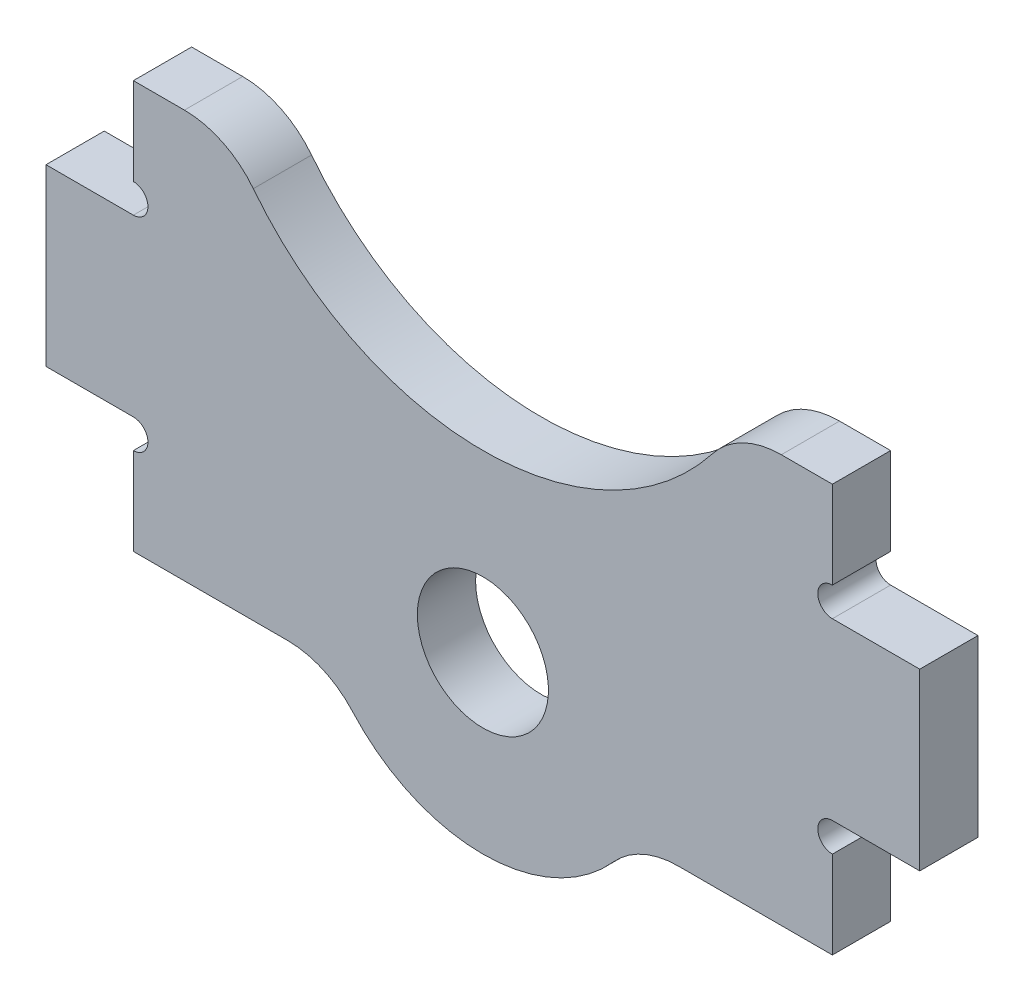
ISO-10303-21;
HEADER;
FILE_DESCRIPTION(('STEP AP214'),'2;1');
FILE_NAME('part.step','',(''),(''),'','','');
FILE_SCHEMA(('AUTOMOTIVE_DESIGN { 1 0 10303 214 1 1 1 1 }'));
ENDSEC;
DATA;
#1=APPLICATION_CONTEXT('core data for automotive mechanical design processes');
#2=APPLICATION_PROTOCOL_DEFINITION('international standard','automotive_design',2000,#1);
#3=PRODUCT_CONTEXT('',#1,'mechanical');
#4=PRODUCT('Part','Part','',(#3));
#5=PRODUCT_RELATED_PRODUCT_CATEGORY('part','',(#4));
#6=PRODUCT_DEFINITION_FORMATION('','',#4);
#7=PRODUCT_DEFINITION_CONTEXT('part definition',#1,'design');
#8=PRODUCT_DEFINITION('design','',#6,#7);
#9=PRODUCT_DEFINITION_SHAPE('','',#8);
#10=(LENGTH_UNIT() NAMED_UNIT(*) SI_UNIT(.MILLI.,.METRE.));
#11=(NAMED_UNIT(*) PLANE_ANGLE_UNIT() SI_UNIT($,.RADIAN.));
#12=(NAMED_UNIT(*) SI_UNIT($,.STERADIAN.) SOLID_ANGLE_UNIT());
#13=UNCERTAINTY_MEASURE_WITH_UNIT(LENGTH_MEASURE(1.E-05),#10,'distance_accuracy_value','');
#14=(GEOMETRIC_REPRESENTATION_CONTEXT(3) GLOBAL_UNCERTAINTY_ASSIGNED_CONTEXT((#13)) GLOBAL_UNIT_ASSIGNED_CONTEXT((#10,
#11,#12)) REPRESENTATION_CONTEXT('',''));
#15=CARTESIAN_POINT('',(0.,0.,0.));
#16=DIRECTION('',(0.,0.,1.));
#17=DIRECTION('',(1.,0.,0.));
#18=AXIS2_PLACEMENT_3D('',#15,#16,#17);
#19=CARTESIAN_POINT('',(0.,18.5000001639128,30.3));
#20=DIRECTION('',(0.,0.,1.));
#21=DIRECTION('',(1.,0.,0.));
#22=AXIS2_PLACEMENT_3D('',#19,#20,#21);
#23=PLANE('',#22);
#24=CARTESIAN_POINT('',(0.,16.0000000149012,30.3));
#25=DIRECTION('',(0.,0.,1.));
#26=DIRECTION('',(1.,0.,0.));
#27=AXIS2_PLACEMENT_3D('',#24,#25,#26);
#28=CIRCLE('',#27,2.25);
#29=CARTESIAN_POINT('',(-2.25,16.0000000149012,30.3));
#30=VERTEX_POINT('',#29);
#31=EDGE_CURVE('E327',#30,#30,#28,.T.);
#32=ORIENTED_EDGE('',*,*,#31,.T.);
#33=EDGE_LOOP('',(#32));
#34=FACE_BOUND('',#33,.T.);
#35=CARTESIAN_POINT('',(0.,16.0000000149012,30.3));
#36=DIRECTION('',(0.,0.,1.));
#37=DIRECTION('',(-0.745355979171925,-0.666666681567829,0.));
#38=AXIS2_PLACEMENT_3D('',#35,#36,#37);
#39=CIRCLE('',#38,5.99999986588955);
#40=CARTESIAN_POINT('',(-4.47213577507152,12.0000000149012,30.3));
#41=VERTEX_POINT('',#40);
#42=CARTESIAN_POINT('',(4.47213577507152,12.0000000149012,30.3));
#43=VERTEX_POINT('',#42);
#44=EDGE_CURVE('E52',#41,#43,#39,.T.);
#45=ORIENTED_EDGE('',*,*,#44,.F.);
#46=CARTESIAN_POINT('',(-6.70820371258729,9.99999997019767,30.3));
#47=DIRECTION('',(0.,0.,1.));
#48=DIRECTION('',(0.745355979171926,0.666666681567828,0.));
#49=AXIS2_PLACEMENT_3D('',#46,#47,#48);
#50=CIRCLE('',#49,3.);
#51=CARTESIAN_POINT('',(-6.7082037125873,12.9999999701977,30.3));
#52=VERTEX_POINT('',#51);
#53=EDGE_CURVE('E323',#41,#52,#50,.T.);
#54=ORIENTED_EDGE('',*,*,#53,.T.);
#55=DIRECTION('',(-1.,0.,0.));
#56=VECTOR('',#55,1.);
#57=CARTESIAN_POINT('',(-6.7082037125873,12.9999999701977,30.3));
#58=LINE('',#57,#56);
#59=CARTESIAN_POINT('',(-12.0000001788139,12.9999999701977,30.3));
#60=VERTEX_POINT('',#59);
#61=EDGE_CURVE('E248',#52,#60,#58,.T.);
#62=ORIENTED_EDGE('',*,*,#61,.T.);
#63=DIRECTION('',(0.,-1.,0.));
#64=VECTOR('',#63,1.);
#65=CARTESIAN_POINT('',(-12.0000001788139,16.0000000149011,30.3));
#66=LINE('',#65,#64);
#67=CARTESIAN_POINT('',(-12.0000001713634,16.0000000149011,30.3));
#68=VERTEX_POINT('',#67);
#69=EDGE_CURVE('E294',#68,#60,#66,.T.);
#70=ORIENTED_EDGE('',*,*,#69,.F.);
#71=CARTESIAN_POINT('',(-12.0000001713634,16.5000000298023,30.3));
#72=DIRECTION('',(0.,0.,1.));
#73=DIRECTION('',(1.,0.,0.));
#74=AXIS2_PLACEMENT_3D('',#71,#72,#73);
#75=CIRCLE('',#74,0.5);
#76=CARTESIAN_POINT('',(-12.0000001713634,17.0000000298023,30.3));
#77=VERTEX_POINT('',#76);
#78=EDGE_CURVE('E224',#68,#77,#75,.T.);
#79=ORIENTED_EDGE('',*,*,#78,.T.);
#80=DIRECTION('',(1.,0.,0.));
#81=VECTOR('',#80,1.);
#82=CARTESIAN_POINT('',(-15.0000002235174,17.0000000298023,30.3));
#83=LINE('',#82,#81);
#84=CARTESIAN_POINT('',(-15.0000002235174,17.0000000298023,30.3));
#85=VERTEX_POINT('',#84);
#86=EDGE_CURVE('E218',#85,#77,#83,.T.);
#87=ORIENTED_EDGE('',*,*,#86,.F.);
#88=DIRECTION('',(0.,-1.,0.));
#89=VECTOR('',#88,1.);
#90=CARTESIAN_POINT('',(-15.0000002235174,23.0000001192093,30.3));
#91=LINE('',#90,#89);
#92=CARTESIAN_POINT('',(-15.0000002235174,23.0000001192093,30.3));
#93=VERTEX_POINT('',#92);
#94=EDGE_CURVE('E204',#93,#85,#91,.T.);
#95=ORIENTED_EDGE('',*,*,#94,.F.);
#96=DIRECTION('',(1.,0.,0.));
#97=VECTOR('',#96,1.);
#98=CARTESIAN_POINT('',(-15.0000002235174,23.0000001192093,30.3));
#99=LINE('',#98,#97);
#100=CARTESIAN_POINT('',(-12.0000001713634,23.0000001192093,30.3));
#101=VERTEX_POINT('',#100);
#102=EDGE_CURVE('E46',#93,#101,#99,.T.);
#103=ORIENTED_EDGE('',*,*,#102,.T.);
#104=CARTESIAN_POINT('',(-12.0000001713634,23.5000001341104,30.3));
#105=DIRECTION('',(0.,0.,1.));
#106=DIRECTION('',(1.,0.,0.));
#107=AXIS2_PLACEMENT_3D('',#104,#105,#106);
#108=CIRCLE('',#107,0.499999999999994);
#109=CARTESIAN_POINT('',(-12.0000001713634,24.0000001341104,30.3));
#110=VERTEX_POINT('',#109);
#111=EDGE_CURVE('E247',#101,#110,#108,.T.);
#112=ORIENTED_EDGE('',*,*,#111,.T.);
#113=DIRECTION('',(0.,1.,0.));
#114=VECTOR('',#113,1.);
#115=CARTESIAN_POINT('',(-12.000000178814,24.0000001341104,30.3));
#116=LINE('',#115,#114);
#117=CARTESIAN_POINT('',(-12.000000178814,27.0000001788139,30.3));
#118=VERTEX_POINT('',#117);
#119=EDGE_CURVE('E300',#110,#118,#116,.T.);
#120=ORIENTED_EDGE('',*,*,#119,.T.);
#121=DIRECTION('',(1.,0.,0.));
#122=VECTOR('',#121,1.);
#123=CARTESIAN_POINT('',(-12.000000178814,27.0000001788139,30.3));
#124=LINE('',#123,#122);
#125=CARTESIAN_POINT('',(-10.246950896838,27.0000001788139,30.3));
#126=VERTEX_POINT('',#125);
#127=EDGE_CURVE('E270',#118,#126,#124,.T.);
#128=ORIENTED_EDGE('',*,*,#127,.T.);
#129=CARTESIAN_POINT('',(-10.246950896838,24.0000001788139,30.3));
#130=DIRECTION('',(0.,0.,1.));
#131=DIRECTION('',(0.788226983029462,0.615384614062029,0.));
#132=AXIS2_PLACEMENT_3D('',#129,#130,#131);
#133=CIRCLE('',#132,3.);
#134=CARTESIAN_POINT('',(-7.88226994774964,25.846154021,30.3));
#135=VERTEX_POINT('',#134);
#136=EDGE_CURVE('E378',#135,#126,#133,.T.);
#137=ORIENTED_EDGE('',*,*,#136,.F.);
#138=CARTESIAN_POINT('',(0.,32.0000002533197,30.3));
#139=DIRECTION('',(0.,0.,1.));
#140=DIRECTION('',(-0.788226983029464,-0.615384614062026,0.));
#141=AXIS2_PLACEMENT_3D('',#138,#139,#140);
#142=CIRCLE('',#141,10.0000001490116);
#143=CARTESIAN_POINT('',(7.88226994774964,25.846154021,30.3));
#144=VERTEX_POINT('',#143);
#145=EDGE_CURVE('E262',#135,#144,#142,.T.);
#146=ORIENTED_EDGE('',*,*,#145,.T.);
#147=CARTESIAN_POINT('',(10.246950896838,24.0000001788139,30.3));
#148=DIRECTION('',(0.,0.,1.));
#149=DIRECTION('',(0.,1.,0.));
#150=AXIS2_PLACEMENT_3D('',#147,#148,#149);
#151=CIRCLE('',#150,3.);
#152=CARTESIAN_POINT('',(10.246950896838,27.0000001788139,30.3));
#153=VERTEX_POINT('',#152);
#154=EDGE_CURVE('E238',#153,#144,#151,.T.);
#155=ORIENTED_EDGE('',*,*,#154,.F.);
#156=DIRECTION('',(-1.,0.,0.));
#157=VECTOR('',#156,1.);
#158=CARTESIAN_POINT('',(12.0000001788139,27.0000001788139,30.3));
#159=LINE('',#158,#157);
#160=CARTESIAN_POINT('',(12.0000001788139,27.0000001788139,30.3));
#161=VERTEX_POINT('',#160);
#162=EDGE_CURVE('E364',#161,#153,#159,.T.);
#163=ORIENTED_EDGE('',*,*,#162,.F.);
#164=DIRECTION('',(0.,1.,0.));
#165=VECTOR('',#164,1.);
#166=CARTESIAN_POINT('',(12.0000001788139,24.0000001341105,30.3));
#167=LINE('',#166,#165);
#168=CARTESIAN_POINT('',(12.0000001713634,24.0000001341105,30.3));
#169=VERTEX_POINT('',#168);
#170=EDGE_CURVE('E292',#169,#161,#167,.T.);
#171=ORIENTED_EDGE('',*,*,#170,.F.);
#172=CARTESIAN_POINT('',(12.0000001713634,23.5000001192093,30.3));
#173=DIRECTION('',(0.,0.,1.));
#174=DIRECTION('',(-1.,0.,0.));
#175=AXIS2_PLACEMENT_3D('',#172,#173,#174);
#176=CIRCLE('',#175,0.499999999999994);
#177=CARTESIAN_POINT('',(12.0000001713634,23.0000001192093,30.3));
#178=VERTEX_POINT('',#177);
#179=EDGE_CURVE('E306',#169,#178,#176,.T.);
#180=ORIENTED_EDGE('',*,*,#179,.T.);
#181=DIRECTION('',(-1.,0.,0.));
#182=VECTOR('',#181,1.);
#183=CARTESIAN_POINT('',(15.0000002235174,23.0000001192093,30.3));
#184=LINE('',#183,#182);
#185=CARTESIAN_POINT('',(15.0000002235174,23.0000001192093,30.3));
#186=VERTEX_POINT('',#185);
#187=EDGE_CURVE('E253',#186,#178,#184,.T.);
#188=ORIENTED_EDGE('',*,*,#187,.F.);
#189=DIRECTION('',(0.,-1.,0.));
#190=VECTOR('',#189,1.);
#191=CARTESIAN_POINT('',(15.0000002235174,23.0000001192093,30.3));
#192=LINE('',#191,#190);
#193=CARTESIAN_POINT('',(15.0000002235174,17.0000000298023,30.3));
#194=VERTEX_POINT('',#193);
#195=EDGE_CURVE('E261',#186,#194,#192,.T.);
#196=ORIENTED_EDGE('',*,*,#195,.T.);
#197=DIRECTION('',(-1.,0.,0.));
#198=VECTOR('',#197,1.);
#199=CARTESIAN_POINT('',(15.0000002235174,17.0000000298023,30.3));
#200=LINE('',#199,#198);
#201=CARTESIAN_POINT('',(12.0000001713634,17.0000000298023,30.3));
#202=VERTEX_POINT('',#201);
#203=EDGE_CURVE('E314',#194,#202,#200,.T.);
#204=ORIENTED_EDGE('',*,*,#203,.T.);
#205=CARTESIAN_POINT('',(12.0000001713634,16.5000000149012,30.3));
#206=DIRECTION('',(0.,0.,1.));
#207=DIRECTION('',(-1.,0.,0.));
#208=AXIS2_PLACEMENT_3D('',#205,#206,#207);
#209=CIRCLE('',#208,0.5);
#210=CARTESIAN_POINT('',(12.0000001713634,16.0000000149012,30.3));
#211=VERTEX_POINT('',#210);
#212=EDGE_CURVE('E288',#202,#211,#209,.T.);
#213=ORIENTED_EDGE('',*,*,#212,.T.);
#214=DIRECTION('',(0.,-1.,0.));
#215=VECTOR('',#214,1.);
#216=CARTESIAN_POINT('',(12.0000001788139,16.0000000149012,30.3));
#217=LINE('',#216,#215);
#218=CARTESIAN_POINT('',(12.0000001788139,12.9999999701977,30.3));
#219=VERTEX_POINT('',#218);
#220=EDGE_CURVE('E274',#211,#219,#217,.T.);
#221=ORIENTED_EDGE('',*,*,#220,.T.);
#222=DIRECTION('',(-1.,0.,0.));
#223=VECTOR('',#222,1.);
#224=CARTESIAN_POINT('',(12.0000001788139,12.9999999701977,30.3));
#225=LINE('',#224,#223);
#226=CARTESIAN_POINT('',(6.7082037125873,12.9999999701977,30.3));
#227=VERTEX_POINT('',#226);
#228=EDGE_CURVE('E371',#219,#227,#225,.T.);
#229=ORIENTED_EDGE('',*,*,#228,.T.);
#230=CARTESIAN_POINT('',(6.7082037125873,9.99999997019768,30.3));
#231=DIRECTION('',(0.,0.,1.));
#232=DIRECTION('',(0.,1.,0.));
#233=AXIS2_PLACEMENT_3D('',#230,#231,#232);
#234=CIRCLE('',#233,3.);
#235=EDGE_CURVE('E243',#227,#43,#234,.T.);
#236=ORIENTED_EDGE('',*,*,#235,.T.);
#237=EDGE_LOOP('',(#45,#54,#62,#70,#79,#87,#95,#103,#112,#120,#128,#137,#146,#155,#163,#171,
#180,#188,#196,#204,#213,#221,#229,#236));
#238=FACE_BOUND('',#237,.T.);
#239=ADVANCED_FACE('F42',(#34,#238),#23,.F.);
#240=CARTESIAN_POINT('',(0.,18.5000001639128,32.3));
#241=DIRECTION('',(0.,0.,1.));
#242=DIRECTION('',(1.,0.,0.));
#243=AXIS2_PLACEMENT_3D('',#240,#241,#242);
#244=PLANE('',#243);
#245=CARTESIAN_POINT('',(0.,16.0000000149012,32.3));
#246=DIRECTION('',(0.,0.,-1.));
#247=DIRECTION('',(1.,0.,0.));
#248=AXIS2_PLACEMENT_3D('',#245,#246,#247);
#249=CIRCLE('',#248,2.25);
#250=CARTESIAN_POINT('',(-2.25,16.0000000149012,32.3));
#251=VERTEX_POINT('',#250);
#252=EDGE_CURVE('E282',#251,#251,#249,.T.);
#253=ORIENTED_EDGE('',*,*,#252,.T.);
#254=EDGE_LOOP('',(#253));
#255=FACE_BOUND('',#254,.T.);
#256=CARTESIAN_POINT('',(0.,16.0000000149012,32.3));
#257=DIRECTION('',(0.,0.,1.));
#258=DIRECTION('',(-0.745355979171925,-0.666666681567829,0.));
#259=AXIS2_PLACEMENT_3D('',#256,#257,#258);
#260=CIRCLE('',#259,5.99999986588955);
#261=CARTESIAN_POINT('',(-4.47213577507152,12.0000000149012,32.3));
#262=VERTEX_POINT('',#261);
#263=CARTESIAN_POINT('',(4.47213577507152,12.0000000149012,32.3));
#264=VERTEX_POINT('',#263);
#265=EDGE_CURVE('E11',#262,#264,#260,.T.);
#266=ORIENTED_EDGE('',*,*,#265,.T.);
#267=CARTESIAN_POINT('',(6.7082037125873,9.99999997019768,32.3));
#268=DIRECTION('',(0.,0.,-1.));
#269=DIRECTION('',(0.,1.,0.));
#270=AXIS2_PLACEMENT_3D('',#267,#268,#269);
#271=CIRCLE('',#270,3.);
#272=CARTESIAN_POINT('',(6.7082037125873,12.9999999701977,32.3));
#273=VERTEX_POINT('',#272);
#274=EDGE_CURVE('E240',#264,#273,#271,.T.);
#275=ORIENTED_EDGE('',*,*,#274,.T.);
#276=DIRECTION('',(1.,0.,0.));
#277=VECTOR('',#276,1.);
#278=CARTESIAN_POINT('',(12.0000001788139,12.9999999701977,32.3));
#279=LINE('',#278,#277);
#280=CARTESIAN_POINT('',(12.0000001788139,12.9999999701977,32.3));
#281=VERTEX_POINT('',#280);
#282=EDGE_CURVE('E367',#273,#281,#279,.T.);
#283=ORIENTED_EDGE('',*,*,#282,.T.);
#284=DIRECTION('',(0.,1.,0.));
#285=VECTOR('',#284,1.);
#286=CARTESIAN_POINT('',(12.0000001788139,16.0000000149012,32.3));
#287=LINE('',#286,#285);
#288=CARTESIAN_POINT('',(12.0000001713634,16.0000000149012,32.3));
#289=VERTEX_POINT('',#288);
#290=EDGE_CURVE('E277',#281,#289,#287,.T.);
#291=ORIENTED_EDGE('',*,*,#290,.T.);
#292=CARTESIAN_POINT('',(12.0000001713634,16.5000000149012,32.3));
#293=DIRECTION('',(0.,0.,-1.));
#294=DIRECTION('',(-1.,0.,0.));
#295=AXIS2_PLACEMENT_3D('',#292,#293,#294);
#296=CIRCLE('',#295,0.5);
#297=CARTESIAN_POINT('',(12.0000001713634,17.0000000298023,32.3));
#298=VERTEX_POINT('',#297);
#299=EDGE_CURVE('E286',#289,#298,#296,.T.);
#300=ORIENTED_EDGE('',*,*,#299,.T.);
#301=DIRECTION('',(1.,0.,0.));
#302=VECTOR('',#301,1.);
#303=CARTESIAN_POINT('',(15.0000002235174,17.0000000298023,32.3));
#304=LINE('',#303,#302);
#305=CARTESIAN_POINT('',(15.0000002235174,17.0000000298023,32.3));
#306=VERTEX_POINT('',#305);
#307=EDGE_CURVE('E232',#298,#306,#304,.T.);
#308=ORIENTED_EDGE('',*,*,#307,.T.);
#309=DIRECTION('',(0.,1.,0.));
#310=VECTOR('',#309,1.);
#311=CARTESIAN_POINT('',(15.0000002235174,23.0000001192093,32.3));
#312=LINE('',#311,#310);
#313=CARTESIAN_POINT('',(15.0000002235174,23.0000001192093,32.3));
#314=VERTEX_POINT('',#313);
#315=EDGE_CURVE('E257',#306,#314,#312,.T.);
#316=ORIENTED_EDGE('',*,*,#315,.T.);
#317=DIRECTION('',(-1.,0.,0.));
#318=VECTOR('',#317,1.);
#319=CARTESIAN_POINT('',(15.0000002235174,23.0000001192093,32.3));
#320=LINE('',#319,#318);
#321=CARTESIAN_POINT('',(12.0000001713634,23.0000001192093,32.3));
#322=VERTEX_POINT('',#321);
#323=EDGE_CURVE('E255',#314,#322,#320,.T.);
#324=ORIENTED_EDGE('',*,*,#323,.T.);
#325=CARTESIAN_POINT('',(12.0000001713634,23.5000001192093,32.3));
#326=DIRECTION('',(0.,0.,-1.));
#327=DIRECTION('',(-1.,0.,0.));
#328=AXIS2_PLACEMENT_3D('',#325,#326,#327);
#329=CIRCLE('',#328,0.499999999999994);
#330=CARTESIAN_POINT('',(12.0000001713634,24.0000001341105,32.3));
#331=VERTEX_POINT('',#330);
#332=EDGE_CURVE('E309',#322,#331,#329,.T.);
#333=ORIENTED_EDGE('',*,*,#332,.T.);
#334=DIRECTION('',(0.,1.,0.));
#335=VECTOR('',#334,1.);
#336=CARTESIAN_POINT('',(12.0000001788139,24.0000001341105,32.3));
#337=LINE('',#336,#335);
#338=CARTESIAN_POINT('',(12.0000001788139,27.0000001788139,32.3));
#339=VERTEX_POINT('',#338);
#340=EDGE_CURVE('E321',#331,#339,#337,.T.);
#341=ORIENTED_EDGE('',*,*,#340,.T.);
#342=DIRECTION('',(-1.,0.,0.));
#343=VECTOR('',#342,1.);
#344=CARTESIAN_POINT('',(12.0000001788139,27.0000001788139,32.3));
#345=LINE('',#344,#343);
#346=CARTESIAN_POINT('',(10.246950896838,27.0000001788139,32.3));
#347=VERTEX_POINT('',#346);
#348=EDGE_CURVE('E293',#339,#347,#345,.T.);
#349=ORIENTED_EDGE('',*,*,#348,.T.);
#350=CARTESIAN_POINT('',(10.246950896838,24.0000001788139,32.3));
#351=DIRECTION('',(0.,0.,1.));
#352=DIRECTION('',(0.,1.,0.));
#353=AXIS2_PLACEMENT_3D('',#350,#351,#352);
#354=CIRCLE('',#353,3.);
#355=CARTESIAN_POINT('',(7.88226994774964,25.846154021,32.3));
#356=VERTEX_POINT('',#355);
#357=EDGE_CURVE('E302',#347,#356,#354,.T.);
#358=ORIENTED_EDGE('',*,*,#357,.T.);
#359=CARTESIAN_POINT('',(0.,32.0000002533197,32.3));
#360=DIRECTION('',(0.,0.,-1.));
#361=DIRECTION('',(-0.788226983029464,-0.615384614062026,0.));
#362=AXIS2_PLACEMENT_3D('',#359,#360,#361);
#363=CIRCLE('',#362,10.0000001490116);
#364=CARTESIAN_POINT('',(-7.88226994774964,25.846154021,32.3));
#365=VERTEX_POINT('',#364);
#366=EDGE_CURVE('E239',#356,#365,#363,.T.);
#367=ORIENTED_EDGE('',*,*,#366,.T.);
#368=CARTESIAN_POINT('',(-10.246950896838,24.0000001788139,32.3));
#369=DIRECTION('',(0.,0.,1.));
#370=DIRECTION('',(0.788226983029462,0.615384614062029,0.));
#371=AXIS2_PLACEMENT_3D('',#368,#369,#370);
#372=CIRCLE('',#371,3.);
#373=CARTESIAN_POINT('',(-10.246950896838,27.0000001788139,32.3));
#374=VERTEX_POINT('',#373);
#375=EDGE_CURVE('E386',#365,#374,#372,.T.);
#376=ORIENTED_EDGE('',*,*,#375,.T.);
#377=DIRECTION('',(-1.,0.,0.));
#378=VECTOR('',#377,1.);
#379=CARTESIAN_POINT('',(-12.000000178814,27.0000001788139,32.3));
#380=LINE('',#379,#378);
#381=CARTESIAN_POINT('',(-12.000000178814,27.0000001788139,32.3));
#382=VERTEX_POINT('',#381);
#383=EDGE_CURVE('E313',#374,#382,#380,.T.);
#384=ORIENTED_EDGE('',*,*,#383,.T.);
#385=DIRECTION('',(0.,-1.,0.));
#386=VECTOR('',#385,1.);
#387=CARTESIAN_POINT('',(-12.000000178814,24.0000001341104,32.3));
#388=LINE('',#387,#386);
#389=CARTESIAN_POINT('',(-12.0000001713634,24.0000001341104,32.3));
#390=VERTEX_POINT('',#389);
#391=EDGE_CURVE('E271',#382,#390,#388,.T.);
#392=ORIENTED_EDGE('',*,*,#391,.T.);
#393=CARTESIAN_POINT('',(-12.0000001713634,23.5000001341104,32.3));
#394=DIRECTION('',(0.,0.,-1.));
#395=DIRECTION('',(1.,0.,0.));
#396=AXIS2_PLACEMENT_3D('',#393,#394,#395);
#397=CIRCLE('',#396,0.499999999999994);
#398=CARTESIAN_POINT('',(-12.0000001713634,23.0000001192093,32.3));
#399=VERTEX_POINT('',#398);
#400=EDGE_CURVE('E244',#390,#399,#397,.T.);
#401=ORIENTED_EDGE('',*,*,#400,.T.);
#402=DIRECTION('',(-1.,0.,0.));
#403=VECTOR('',#402,1.);
#404=CARTESIAN_POINT('',(-15.0000002235174,23.0000001192093,32.3));
#405=LINE('',#404,#403);
#406=CARTESIAN_POINT('',(-15.0000002235174,23.0000001192093,32.3));
#407=VERTEX_POINT('',#406);
#408=EDGE_CURVE('E279',#399,#407,#405,.T.);
#409=ORIENTED_EDGE('',*,*,#408,.T.);
#410=DIRECTION('',(0.,-1.,0.));
#411=VECTOR('',#410,1.);
#412=CARTESIAN_POINT('',(-15.0000002235174,23.0000001192093,32.3));
#413=LINE('',#412,#411);
#414=CARTESIAN_POINT('',(-15.0000002235174,17.0000000298023,32.3));
#415=VERTEX_POINT('',#414);
#416=EDGE_CURVE('E198',#407,#415,#413,.T.);
#417=ORIENTED_EDGE('',*,*,#416,.T.);
#418=DIRECTION('',(1.,0.,0.));
#419=VECTOR('',#418,1.);
#420=CARTESIAN_POINT('',(-15.0000002235174,17.0000000298023,32.3));
#421=LINE('',#420,#419);
#422=CARTESIAN_POINT('',(-12.0000001713634,17.0000000298023,32.3));
#423=VERTEX_POINT('',#422);
#424=EDGE_CURVE('E220',#415,#423,#421,.T.);
#425=ORIENTED_EDGE('',*,*,#424,.T.);
#426=CARTESIAN_POINT('',(-12.0000001713634,16.5000000298023,32.3));
#427=DIRECTION('',(0.,0.,-1.));
#428=DIRECTION('',(1.,0.,0.));
#429=AXIS2_PLACEMENT_3D('',#426,#427,#428);
#430=CIRCLE('',#429,0.5);
#431=CARTESIAN_POINT('',(-12.0000001713634,16.0000000149011,32.3));
#432=VERTEX_POINT('',#431);
#433=EDGE_CURVE('E228',#423,#432,#430,.T.);
#434=ORIENTED_EDGE('',*,*,#433,.T.);
#435=DIRECTION('',(0.,-1.,0.));
#436=VECTOR('',#435,1.);
#437=CARTESIAN_POINT('',(-12.0000001788139,16.0000000149011,32.3));
#438=LINE('',#437,#436);
#439=CARTESIAN_POINT('',(-12.0000001788139,12.9999999701977,32.3));
#440=VERTEX_POINT('',#439);
#441=EDGE_CURVE('E296',#432,#440,#438,.T.);
#442=ORIENTED_EDGE('',*,*,#441,.T.);
#443=DIRECTION('',(1.,0.,0.));
#444=VECTOR('',#443,1.);
#445=CARTESIAN_POINT('',(-6.7082037125873,12.9999999701977,32.3));
#446=LINE('',#445,#444);
#447=CARTESIAN_POINT('',(-6.7082037125873,12.9999999701977,32.3));
#448=VERTEX_POINT('',#447);
#449=EDGE_CURVE('E251',#440,#448,#446,.T.);
#450=ORIENTED_EDGE('',*,*,#449,.T.);
#451=CARTESIAN_POINT('',(-6.70820371258729,9.99999997019767,32.3));
#452=DIRECTION('',(0.,0.,-1.));
#453=DIRECTION('',(0.745355979171926,0.666666681567828,0.));
#454=AXIS2_PLACEMENT_3D('',#451,#452,#453);
#455=CIRCLE('',#454,3.);
#456=EDGE_CURVE('E354',#448,#262,#455,.T.);
#457=ORIENTED_EDGE('',*,*,#456,.T.);
#458=EDGE_LOOP('',(#266,#275,#283,#291,#300,#308,#316,#324,#333,#341,#349,#358,#367,#376,#384,
#392,#401,#409,#417,#425,#434,#442,#450,#457));
#459=FACE_BOUND('',#458,.T.);
#460=ADVANCED_FACE('F421',(#255,#459),#244,.T.);
#461=CARTESIAN_POINT('',(0.,16.0000000149012,30.3));
#462=DIRECTION('',(0.,0.,1.));
#463=DIRECTION('',(-0.745355979171925,-0.666666681567829,0.));
#464=AXIS2_PLACEMENT_3D('',#461,#462,#463);
#465=CYLINDRICAL_SURFACE('',#464,5.99999986588955);
#466=ORIENTED_EDGE('',*,*,#44,.T.);
#467=DIRECTION('',(0.,0.,1.));
#468=VECTOR('',#467,1.);
#469=CARTESIAN_POINT('',(4.47213577507152,12.0000000149012,30.3));
#470=LINE('',#469,#468);
#471=EDGE_CURVE('E242',#43,#264,#470,.T.);
#472=ORIENTED_EDGE('',*,*,#471,.T.);
#473=ORIENTED_EDGE('',*,*,#265,.F.);
#474=DIRECTION('',(0.,0.,1.));
#475=VECTOR('',#474,1.);
#476=CARTESIAN_POINT('',(-4.47213577507152,12.0000000149012,30.3));
#477=LINE('',#476,#475);
#478=EDGE_CURVE('E326',#41,#262,#477,.T.);
#479=ORIENTED_EDGE('',*,*,#478,.F.);
#480=EDGE_LOOP('',(#466,#472,#473,#479));
#481=FACE_BOUND('',#480,.T.);
#482=ADVANCED_FACE('F451',(#481),#465,.T.);
#483=CARTESIAN_POINT('',(6.7082037125873,9.99999997019768,30.3));
#484=DIRECTION('',(0.,0.,1.));
#485=DIRECTION('',(0.,1.,0.));
#486=AXIS2_PLACEMENT_3D('',#483,#484,#485);
#487=CYLINDRICAL_SURFACE('',#486,3.);
#488=ORIENTED_EDGE('',*,*,#235,.F.);
#489=DIRECTION('',(0.,0.,1.));
#490=VECTOR('',#489,1.);
#491=CARTESIAN_POINT('',(6.7082037125873,12.9999999701977,30.3));
#492=LINE('',#491,#490);
#493=EDGE_CURVE('E370',#227,#273,#492,.T.);
#494=ORIENTED_EDGE('',*,*,#493,.T.);
#495=ORIENTED_EDGE('',*,*,#274,.F.);
#496=ORIENTED_EDGE('',*,*,#471,.F.);
#497=EDGE_LOOP('',(#488,#494,#495,#496));
#498=FACE_BOUND('',#497,.T.);
#499=ADVANCED_FACE('F460',(#498),#487,.F.);
#500=CARTESIAN_POINT('',(6.7082037125873,12.9999999701977,30.3));
#501=DIRECTION('',(0.,-1.,0.));
#502=DIRECTION('',(0.,0.,-1.));
#503=AXIS2_PLACEMENT_3D('',#500,#501,#502);
#504=PLANE('',#503);
#505=ORIENTED_EDGE('',*,*,#228,.F.);
#506=DIRECTION('',(0.,0.,1.));
#507=VECTOR('',#506,1.);
#508=CARTESIAN_POINT('',(12.0000001788139,12.9999999701977,30.3));
#509=LINE('',#508,#507);
#510=EDGE_CURVE('E349',#219,#281,#509,.T.);
#511=ORIENTED_EDGE('',*,*,#510,.T.);
#512=ORIENTED_EDGE('',*,*,#282,.F.);
#513=ORIENTED_EDGE('',*,*,#493,.F.);
#514=EDGE_LOOP('',(#505,#511,#512,#513));
#515=FACE_BOUND('',#514,.T.);
#516=ADVANCED_FACE('F468',(#515),#504,.T.);
#517=CARTESIAN_POINT('',(12.0000001788139,12.9999999701977,30.3));
#518=DIRECTION('',(1.,0.,0.));
#519=DIRECTION('',(0.,1.,0.));
#520=AXIS2_PLACEMENT_3D('',#517,#518,#519);
#521=PLANE('',#520);
#522=ORIENTED_EDGE('',*,*,#220,.F.);
#523=DIRECTION('',(0.,0.,1.));
#524=VECTOR('',#523,1.);
#525=CARTESIAN_POINT('',(12.0000001713634,16.0000000149012,30.3));
#526=LINE('',#525,#524);
#527=EDGE_CURVE('E278',#211,#289,#526,.T.);
#528=ORIENTED_EDGE('',*,*,#527,.T.);
#529=ORIENTED_EDGE('',*,*,#290,.F.);
#530=ORIENTED_EDGE('',*,*,#510,.F.);
#531=EDGE_LOOP('',(#522,#528,#529,#530));
#532=FACE_BOUND('',#531,.T.);
#533=ADVANCED_FACE('F471',(#532),#521,.T.);
#534=CARTESIAN_POINT('',(12.0000001713634,16.5000000149012,30.3));
#535=DIRECTION('',(0.,0.,1.));
#536=DIRECTION('',(-1.,0.,0.));
#537=AXIS2_PLACEMENT_3D('',#534,#535,#536);
#538=CYLINDRICAL_SURFACE('',#537,0.5);
#539=ORIENTED_EDGE('',*,*,#212,.F.);
#540=DIRECTION('',(0.,0.,1.));
#541=VECTOR('',#540,1.);
#542=CARTESIAN_POINT('',(12.0000001713634,17.0000000298023,30.3));
#543=LINE('',#542,#541);
#544=EDGE_CURVE('E305',#202,#298,#543,.T.);
#545=ORIENTED_EDGE('',*,*,#544,.T.);
#546=ORIENTED_EDGE('',*,*,#299,.F.);
#547=ORIENTED_EDGE('',*,*,#527,.F.);
#548=EDGE_LOOP('',(#539,#545,#546,#547));
#549=FACE_BOUND('',#548,.T.);
#550=ADVANCED_FACE('F473',(#549),#538,.F.);
#551=CARTESIAN_POINT('',(12.0000001713634,17.0000000298023,30.3));
#552=DIRECTION('',(0.,-1.,0.));
#553=DIRECTION('',(0.,0.,-1.));
#554=AXIS2_PLACEMENT_3D('',#551,#552,#553);
#555=PLANE('',#554);
#556=ORIENTED_EDGE('',*,*,#203,.F.);
#557=DIRECTION('',(0.,0.,1.));
#558=VECTOR('',#557,1.);
#559=CARTESIAN_POINT('',(15.0000002235174,17.0000000298023,30.3));
#560=LINE('',#559,#558);
#561=EDGE_CURVE('E260',#194,#306,#560,.T.);
#562=ORIENTED_EDGE('',*,*,#561,.T.);
#563=ORIENTED_EDGE('',*,*,#307,.F.);
#564=ORIENTED_EDGE('',*,*,#544,.F.);
#565=EDGE_LOOP('',(#556,#562,#563,#564));
#566=FACE_BOUND('',#565,.T.);
#567=ADVANCED_FACE('F476',(#566),#555,.T.);
#568=CARTESIAN_POINT('',(15.0000002235174,17.0000000298023,30.3));
#569=DIRECTION('',(1.,0.,0.));
#570=DIRECTION('',(0.,1.,0.));
#571=AXIS2_PLACEMENT_3D('',#568,#569,#570);
#572=PLANE('',#571);
#573=ORIENTED_EDGE('',*,*,#195,.F.);
#574=DIRECTION('',(0.,0.,1.));
#575=VECTOR('',#574,1.);
#576=CARTESIAN_POINT('',(15.0000002235174,23.0000001192093,30.3));
#577=LINE('',#576,#575);
#578=EDGE_CURVE('E267',#186,#314,#577,.T.);
#579=ORIENTED_EDGE('',*,*,#578,.T.);
#580=ORIENTED_EDGE('',*,*,#315,.F.);
#581=ORIENTED_EDGE('',*,*,#561,.F.);
#582=EDGE_LOOP('',(#573,#579,#580,#581));
#583=FACE_BOUND('',#582,.T.);
#584=ADVANCED_FACE('F466',(#583),#572,.T.);
#585=CARTESIAN_POINT('',(15.0000002235174,23.0000001192093,30.3));
#586=DIRECTION('',(0.,1.,0.));
#587=DIRECTION('',(1.,0.,0.));
#588=AXIS2_PLACEMENT_3D('',#585,#586,#587);
#589=PLANE('',#588);
#590=ORIENTED_EDGE('',*,*,#187,.T.);
#591=DIRECTION('',(0.,0.,1.));
#592=VECTOR('',#591,1.);
#593=CARTESIAN_POINT('',(12.0000001713634,23.0000001192093,30.3));
#594=LINE('',#593,#592);
#595=EDGE_CURVE('E256',#178,#322,#594,.T.);
#596=ORIENTED_EDGE('',*,*,#595,.T.);
#597=ORIENTED_EDGE('',*,*,#323,.F.);
#598=ORIENTED_EDGE('',*,*,#578,.F.);
#599=EDGE_LOOP('',(#590,#596,#597,#598));
#600=FACE_BOUND('',#599,.T.);
#601=ADVANCED_FACE('F462',(#600),#589,.T.);
#602=CARTESIAN_POINT('',(12.0000001713634,23.5000001192093,30.3));
#603=DIRECTION('',(0.,0.,1.));
#604=DIRECTION('',(-1.,0.,0.));
#605=AXIS2_PLACEMENT_3D('',#602,#603,#604);
#606=CYLINDRICAL_SURFACE('',#605,0.499999999999994);
#607=ORIENTED_EDGE('',*,*,#179,.F.);
#608=DIRECTION('',(0.,0.,1.));
#609=VECTOR('',#608,1.);
#610=CARTESIAN_POINT('',(12.0000001713634,24.0000001341105,30.3));
#611=LINE('',#610,#609);
#612=EDGE_CURVE('E310',#169,#331,#611,.T.);
#613=ORIENTED_EDGE('',*,*,#612,.T.);
#614=ORIENTED_EDGE('',*,*,#332,.F.);
#615=ORIENTED_EDGE('',*,*,#595,.F.);
#616=EDGE_LOOP('',(#607,#613,#614,#615));
#617=FACE_BOUND('',#616,.T.);
#618=ADVANCED_FACE('F465',(#617),#606,.F.);
#619=CARTESIAN_POINT('',(12.0000001788139,24.0000001341105,30.3));
#620=DIRECTION('',(1.,0.,0.));
#621=DIRECTION('',(0.,1.,0.));
#622=AXIS2_PLACEMENT_3D('',#619,#620,#621);
#623=PLANE('',#622);
#624=ORIENTED_EDGE('',*,*,#170,.T.);
#625=DIRECTION('',(0.,0.,1.));
#626=VECTOR('',#625,1.);
#627=CARTESIAN_POINT('',(12.0000001788139,27.0000001788139,30.3));
#628=LINE('',#627,#626);
#629=EDGE_CURVE('E289',#161,#339,#628,.T.);
#630=ORIENTED_EDGE('',*,*,#629,.T.);
#631=ORIENTED_EDGE('',*,*,#340,.F.);
#632=ORIENTED_EDGE('',*,*,#612,.F.);
#633=EDGE_LOOP('',(#624,#630,#631,#632));
#634=FACE_BOUND('',#633,.T.);
#635=ADVANCED_FACE('F491',(#634),#623,.T.);
#636=CARTESIAN_POINT('',(12.0000001788139,27.0000001788139,30.3));
#637=DIRECTION('',(0.,1.,0.));
#638=DIRECTION('',(1.,0.,0.));
#639=AXIS2_PLACEMENT_3D('',#636,#637,#638);
#640=PLANE('',#639);
#641=ORIENTED_EDGE('',*,*,#162,.T.);
#642=DIRECTION('',(0.,0.,1.));
#643=VECTOR('',#642,1.);
#644=CARTESIAN_POINT('',(10.246950896838,27.0000001788139,30.3));
#645=LINE('',#644,#643);
#646=EDGE_CURVE('E345',#153,#347,#645,.T.);
#647=ORIENTED_EDGE('',*,*,#646,.T.);
#648=ORIENTED_EDGE('',*,*,#348,.F.);
#649=ORIENTED_EDGE('',*,*,#629,.F.);
#650=EDGE_LOOP('',(#641,#647,#648,#649));
#651=FACE_BOUND('',#650,.T.);
#652=ADVANCED_FACE('F404',(#651),#640,.T.);
#653=CARTESIAN_POINT('',(10.246950896838,24.0000001788139,30.3));
#654=DIRECTION('',(0.,0.,1.));
#655=DIRECTION('',(0.,1.,0.));
#656=AXIS2_PLACEMENT_3D('',#653,#654,#655);
#657=CYLINDRICAL_SURFACE('',#656,3.);
#658=ORIENTED_EDGE('',*,*,#154,.T.);
#659=DIRECTION('',(0.,0.,1.));
#660=VECTOR('',#659,1.);
#661=CARTESIAN_POINT('',(7.88226994774964,25.846154021,30.3));
#662=LINE('',#661,#660);
#663=EDGE_CURVE('E235',#144,#356,#662,.T.);
#664=ORIENTED_EDGE('',*,*,#663,.T.);
#665=ORIENTED_EDGE('',*,*,#357,.F.);
#666=ORIENTED_EDGE('',*,*,#646,.F.);
#667=EDGE_LOOP('',(#658,#664,#665,#666));
#668=FACE_BOUND('',#667,.T.);
#669=ADVANCED_FACE('F409',(#668),#657,.T.);
#670=CARTESIAN_POINT('',(0.,32.0000002533197,30.3));
#671=DIRECTION('',(0.,0.,1.));
#672=DIRECTION('',(-0.788226983029464,-0.615384614062026,0.));
#673=AXIS2_PLACEMENT_3D('',#670,#671,#672);
#674=CYLINDRICAL_SURFACE('',#673,10.0000001490116);
#675=ORIENTED_EDGE('',*,*,#145,.F.);
#676=DIRECTION('',(0.,0.,1.));
#677=VECTOR('',#676,1.);
#678=CARTESIAN_POINT('',(-7.88226994774964,25.846154021,30.3));
#679=LINE('',#678,#677);
#680=EDGE_CURVE('E265',#135,#365,#679,.T.);
#681=ORIENTED_EDGE('',*,*,#680,.T.);
#682=ORIENTED_EDGE('',*,*,#366,.F.);
#683=ORIENTED_EDGE('',*,*,#663,.F.);
#684=EDGE_LOOP('',(#675,#681,#682,#683));
#685=FACE_BOUND('',#684,.T.);
#686=ADVANCED_FACE('F414',(#685),#674,.F.);
#687=CARTESIAN_POINT('',(-10.246950896838,24.0000001788139,30.3));
#688=DIRECTION('',(0.,0.,1.));
#689=DIRECTION('',(0.788226983029462,0.615384614062029,0.));
#690=AXIS2_PLACEMENT_3D('',#687,#688,#689);
#691=CYLINDRICAL_SURFACE('',#690,3.);
#692=ORIENTED_EDGE('',*,*,#136,.T.);
#693=DIRECTION('',(0.,0.,1.));
#694=VECTOR('',#693,1.);
#695=CARTESIAN_POINT('',(-10.246950896838,27.0000001788139,30.3));
#696=LINE('',#695,#694);
#697=EDGE_CURVE('E351',#126,#374,#696,.T.);
#698=ORIENTED_EDGE('',*,*,#697,.T.);
#699=ORIENTED_EDGE('',*,*,#375,.F.);
#700=ORIENTED_EDGE('',*,*,#680,.F.);
#701=EDGE_LOOP('',(#692,#698,#699,#700));
#702=FACE_BOUND('',#701,.T.);
#703=ADVANCED_FACE('F418',(#702),#691,.T.);
#704=CARTESIAN_POINT('',(-10.246950896838,27.0000001788139,30.3));
#705=DIRECTION('',(0.,1.,0.));
#706=DIRECTION('',(1.,0.,0.));
#707=AXIS2_PLACEMENT_3D('',#704,#705,#706);
#708=PLANE('',#707);
#709=ORIENTED_EDGE('',*,*,#127,.F.);
#710=DIRECTION('',(0.,0.,1.));
#711=VECTOR('',#710,1.);
#712=CARTESIAN_POINT('',(-12.000000178814,27.0000001788139,30.3));
#713=LINE('',#712,#711);
#714=EDGE_CURVE('E268',#118,#382,#713,.T.);
#715=ORIENTED_EDGE('',*,*,#714,.T.);
#716=ORIENTED_EDGE('',*,*,#383,.F.);
#717=ORIENTED_EDGE('',*,*,#697,.F.);
#718=EDGE_LOOP('',(#709,#715,#716,#717));
#719=FACE_BOUND('',#718,.T.);
#720=ADVANCED_FACE('F44',(#719),#708,.T.);
#721=CARTESIAN_POINT('',(-12.000000178814,27.0000001788139,30.3));
#722=DIRECTION('',(-1.,0.,0.));
#723=DIRECTION('',(0.,1.,0.));
#724=AXIS2_PLACEMENT_3D('',#721,#722,#723);
#725=PLANE('',#724);
#726=ORIENTED_EDGE('',*,*,#119,.F.);
#727=DIRECTION('',(0.,0.,1.));
#728=VECTOR('',#727,1.);
#729=CARTESIAN_POINT('',(-12.0000001713634,24.0000001341104,30.3));
#730=LINE('',#729,#728);
#731=EDGE_CURVE('E246',#110,#390,#730,.T.);
#732=ORIENTED_EDGE('',*,*,#731,.T.);
#733=ORIENTED_EDGE('',*,*,#391,.F.);
#734=ORIENTED_EDGE('',*,*,#714,.F.);
#735=EDGE_LOOP('',(#726,#732,#733,#734));
#736=FACE_BOUND('',#735,.T.);
#737=ADVANCED_FACE('F426',(#736),#725,.T.);
#738=CARTESIAN_POINT('',(-12.0000001713634,23.5000001341104,30.3));
#739=DIRECTION('',(0.,0.,1.));
#740=DIRECTION('',(1.,0.,0.));
#741=AXIS2_PLACEMENT_3D('',#738,#739,#740);
#742=CYLINDRICAL_SURFACE('',#741,0.499999999999994);
#743=ORIENTED_EDGE('',*,*,#111,.F.);
#744=DIRECTION('',(0.,0.,1.));
#745=VECTOR('',#744,1.);
#746=CARTESIAN_POINT('',(-12.0000001713634,23.0000001192093,30.3));
#747=LINE('',#746,#745);
#748=EDGE_CURVE('E281',#101,#399,#747,.T.);
#749=ORIENTED_EDGE('',*,*,#748,.T.);
#750=ORIENTED_EDGE('',*,*,#400,.F.);
#751=ORIENTED_EDGE('',*,*,#731,.F.);
#752=EDGE_LOOP('',(#743,#749,#750,#751));
#753=FACE_BOUND('',#752,.T.);
#754=ADVANCED_FACE('F430',(#753),#742,.F.);
#755=CARTESIAN_POINT('',(-12.0000001713634,23.0000001192093,30.3));
#756=DIRECTION('',(0.,1.,0.));
#757=DIRECTION('',(1.,0.,0.));
#758=AXIS2_PLACEMENT_3D('',#755,#756,#757);
#759=PLANE('',#758);
#760=ORIENTED_EDGE('',*,*,#102,.F.);
#761=DIRECTION('',(0.,0.,1.));
#762=VECTOR('',#761,1.);
#763=CARTESIAN_POINT('',(-15.0000002235174,23.0000001192093,30.3));
#764=LINE('',#763,#762);
#765=EDGE_CURVE('E210',#93,#407,#764,.T.);
#766=ORIENTED_EDGE('',*,*,#765,.T.);
#767=ORIENTED_EDGE('',*,*,#408,.F.);
#768=ORIENTED_EDGE('',*,*,#748,.F.);
#769=EDGE_LOOP('',(#760,#766,#767,#768));
#770=FACE_BOUND('',#769,.T.);
#771=ADVANCED_FACE('F434',(#770),#759,.T.);
#772=CARTESIAN_POINT('',(-15.0000002235174,23.0000001192093,30.3));
#773=DIRECTION('',(-1.,0.,0.));
#774=DIRECTION('',(0.,1.,0.));
#775=AXIS2_PLACEMENT_3D('',#772,#773,#774);
#776=PLANE('',#775);
#777=ORIENTED_EDGE('',*,*,#94,.T.);
#778=DIRECTION('',(0.,0.,1.));
#779=VECTOR('',#778,1.);
#780=CARTESIAN_POINT('',(-15.0000002235174,17.0000000298023,30.3));
#781=LINE('',#780,#779);
#782=EDGE_CURVE('E207',#85,#415,#781,.T.);
#783=ORIENTED_EDGE('',*,*,#782,.T.);
#784=ORIENTED_EDGE('',*,*,#416,.F.);
#785=ORIENTED_EDGE('',*,*,#765,.F.);
#786=EDGE_LOOP('',(#777,#783,#784,#785));
#787=FACE_BOUND('',#786,.T.);
#788=ADVANCED_FACE('F206',(#787),#776,.T.);
#789=CARTESIAN_POINT('',(-15.0000002235174,17.0000000298023,30.3));
#790=DIRECTION('',(0.,-1.,0.));
#791=DIRECTION('',(0.,0.,-1.));
#792=AXIS2_PLACEMENT_3D('',#789,#790,#791);
#793=PLANE('',#792);
#794=ORIENTED_EDGE('',*,*,#86,.T.);
#795=DIRECTION('',(0.,0.,1.));
#796=VECTOR('',#795,1.);
#797=CARTESIAN_POINT('',(-12.0000001713634,17.0000000298023,30.3));
#798=LINE('',#797,#796);
#799=EDGE_CURVE('E225',#77,#423,#798,.T.);
#800=ORIENTED_EDGE('',*,*,#799,.T.);
#801=ORIENTED_EDGE('',*,*,#424,.F.);
#802=ORIENTED_EDGE('',*,*,#782,.F.);
#803=EDGE_LOOP('',(#794,#800,#801,#802));
#804=FACE_BOUND('',#803,.T.);
#805=ADVANCED_FACE('F216',(#804),#793,.T.);
#806=CARTESIAN_POINT('',(-12.0000001713634,16.5000000298023,30.3));
#807=DIRECTION('',(0.,0.,1.));
#808=DIRECTION('',(1.,0.,0.));
#809=AXIS2_PLACEMENT_3D('',#806,#807,#808);
#810=CYLINDRICAL_SURFACE('',#809,0.5);
#811=ORIENTED_EDGE('',*,*,#78,.F.);
#812=DIRECTION('',(0.,0.,1.));
#813=VECTOR('',#812,1.);
#814=CARTESIAN_POINT('',(-12.0000001713634,16.0000000149011,30.3));
#815=LINE('',#814,#813);
#816=EDGE_CURVE('E318',#68,#432,#815,.T.);
#817=ORIENTED_EDGE('',*,*,#816,.T.);
#818=ORIENTED_EDGE('',*,*,#433,.F.);
#819=ORIENTED_EDGE('',*,*,#799,.F.);
#820=EDGE_LOOP('',(#811,#817,#818,#819));
#821=FACE_BOUND('',#820,.T.);
#822=ADVANCED_FACE('F457',(#821),#810,.F.);
#823=CARTESIAN_POINT('',(-12.0000001788139,16.0000000149011,30.3));
#824=DIRECTION('',(-1.,0.,0.));
#825=DIRECTION('',(0.,1.,0.));
#826=AXIS2_PLACEMENT_3D('',#823,#824,#825);
#827=PLANE('',#826);
#828=ORIENTED_EDGE('',*,*,#69,.T.);
#829=DIRECTION('',(0.,0.,1.));
#830=VECTOR('',#829,1.);
#831=CARTESIAN_POINT('',(-12.0000001788139,12.9999999701977,30.3));
#832=LINE('',#831,#830);
#833=EDGE_CURVE('E297',#60,#440,#832,.T.);
#834=ORIENTED_EDGE('',*,*,#833,.T.);
#835=ORIENTED_EDGE('',*,*,#441,.F.);
#836=ORIENTED_EDGE('',*,*,#816,.F.);
#837=EDGE_LOOP('',(#828,#834,#835,#836));
#838=FACE_BOUND('',#837,.T.);
#839=ADVANCED_FACE('F484',(#838),#827,.T.);
#840=CARTESIAN_POINT('',(-12.0000001788139,12.9999999701977,30.3));
#841=DIRECTION('',(0.,-1.,0.));
#842=DIRECTION('',(0.,0.,-1.));
#843=AXIS2_PLACEMENT_3D('',#840,#841,#842);
#844=PLANE('',#843);
#845=ORIENTED_EDGE('',*,*,#61,.F.);
#846=DIRECTION('',(0.,0.,1.));
#847=VECTOR('',#846,1.);
#848=CARTESIAN_POINT('',(-6.7082037125873,12.9999999701977,30.3));
#849=LINE('',#848,#847);
#850=EDGE_CURVE('E252',#52,#448,#849,.T.);
#851=ORIENTED_EDGE('',*,*,#850,.T.);
#852=ORIENTED_EDGE('',*,*,#449,.F.);
#853=ORIENTED_EDGE('',*,*,#833,.F.);
#854=EDGE_LOOP('',(#845,#851,#852,#853));
#855=FACE_BOUND('',#854,.T.);
#856=ADVANCED_FACE('F454',(#855),#844,.T.);
#857=CARTESIAN_POINT('',(-6.70820371258729,9.99999997019767,30.3));
#858=DIRECTION('',(0.,0.,1.));
#859=DIRECTION('',(0.745355979171926,0.666666681567828,0.));
#860=AXIS2_PLACEMENT_3D('',#857,#858,#859);
#861=CYLINDRICAL_SURFACE('',#860,3.);
#862=ORIENTED_EDGE('',*,*,#53,.F.);
#863=ORIENTED_EDGE('',*,*,#478,.T.);
#864=ORIENTED_EDGE('',*,*,#456,.F.);
#865=ORIENTED_EDGE('',*,*,#850,.F.);
#866=EDGE_LOOP('',(#862,#863,#864,#865));
#867=FACE_BOUND('',#866,.T.);
#868=ADVANCED_FACE('F509',(#867),#861,.F.);
#869=CARTESIAN_POINT('',(0.,16.0000000149012,30.3));
#870=DIRECTION('',(0.,0.,1.));
#871=DIRECTION('',(1.,0.,0.));
#872=AXIS2_PLACEMENT_3D('',#869,#870,#871);
#873=CYLINDRICAL_SURFACE('',#872,2.25);
#874=ORIENTED_EDGE('',*,*,#252,.F.);
#875=DIRECTION('',(0.,0.,-1.));
#876=VECTOR('',#875,1.);
#877=CARTESIAN_POINT('',(-2.25,16.0000000149012,30.3));
#878=LINE('',#877,#876);
#879=EDGE_CURVE('E285',#251,#30,#878,.T.);
#880=ORIENTED_EDGE('',*,*,#879,.T.);
#881=ORIENTED_EDGE('',*,*,#31,.F.);
#882=ORIENTED_EDGE('',*,*,#879,.F.);
#883=EDGE_LOOP('',(#874,#880,#881,#882));
#884=FACE_BOUND('',#883,.T.);
#885=ADVANCED_FACE('F542',(#884),#873,.F.);
#886=CLOSED_SHELL('',(#239,#460,#482,#499,#516,#533,#550,#567,#584,#601,#618,#635,#652,#669,
#686,#703,#720,#737,#754,#771,#788,#805,#822,#839,#856,#868,#885));
#887=MANIFOLD_SOLID_BREP('B2',#886);
#888=ADVANCED_BREP_SHAPE_REPRESENTATION('',(#18,#887),#14);
#889=SHAPE_DEFINITION_REPRESENTATION(#9,#888);
ENDSEC;
END-ISO-10303-21;
